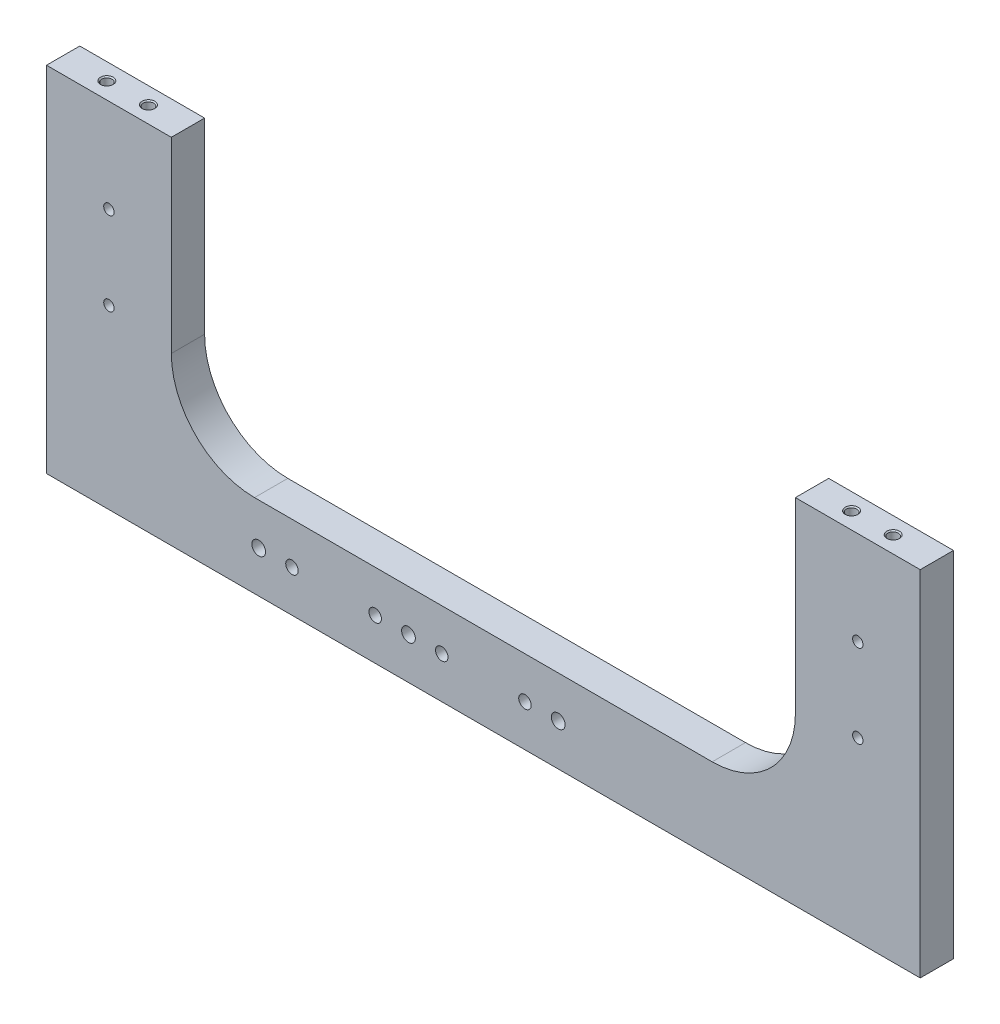
ISO-10303-21;
HEADER;
FILE_DESCRIPTION(('STEP AP214'),'2;1');
FILE_NAME('part.step','',(''),(''),'','','');
FILE_SCHEMA(('AUTOMOTIVE_DESIGN { 1 0 10303 214 1 1 1 1 }'));
ENDSEC;
DATA;
#1=APPLICATION_CONTEXT('core data for automotive mechanical design processes');
#2=APPLICATION_PROTOCOL_DEFINITION('international standard','automotive_design',2000,#1);
#3=PRODUCT_CONTEXT('',#1,'mechanical');
#4=PRODUCT('Part','Part','',(#3));
#5=PRODUCT_RELATED_PRODUCT_CATEGORY('part','',(#4));
#6=PRODUCT_DEFINITION_FORMATION('','',#4);
#7=PRODUCT_DEFINITION_CONTEXT('part definition',#1,'design');
#8=PRODUCT_DEFINITION('design','',#6,#7);
#9=PRODUCT_DEFINITION_SHAPE('','',#8);
#10=(LENGTH_UNIT() NAMED_UNIT(*) SI_UNIT(.MILLI.,.METRE.));
#11=(NAMED_UNIT(*) PLANE_ANGLE_UNIT() SI_UNIT($,.RADIAN.));
#12=(NAMED_UNIT(*) SI_UNIT($,.STERADIAN.) SOLID_ANGLE_UNIT());
#13=UNCERTAINTY_MEASURE_WITH_UNIT(LENGTH_MEASURE(1.E-05),#10,'distance_accuracy_value','');
#14=(GEOMETRIC_REPRESENTATION_CONTEXT(3) GLOBAL_UNCERTAINTY_ASSIGNED_CONTEXT((#13)) GLOBAL_UNIT_ASSIGNED_CONTEXT((#10,
#11,#12)) REPRESENTATION_CONTEXT('',''));
#15=CARTESIAN_POINT('',(0.,0.,0.));
#16=DIRECTION('',(0.,0.,1.));
#17=DIRECTION('',(1.,0.,0.));
#18=AXIS2_PLACEMENT_3D('',#15,#16,#17);
#19=CARTESIAN_POINT('',(-105.,42.5,8.));
#20=DIRECTION('',(0.,-1.,0.));
#21=DIRECTION('',(0.,0.,-1.));
#22=AXIS2_PLACEMENT_3D('',#19,#20,#21);
#23=PLANE('',#22);
#24=CARTESIAN_POINT('',(-84.5,42.5,4.));
#25=DIRECTION('',(0.,1.,0.));
#26=DIRECTION('',(0.,0.,1.));
#27=AXIS2_PLACEMENT_3D('',#24,#25,#26);
#28=CIRCLE('',#27,1.525);
#29=CARTESIAN_POINT('',(-84.5,42.5,5.525));
#30=VERTEX_POINT('',#29);
#31=EDGE_CURVE('E295',#30,#30,#28,.T.);
#32=ORIENTED_EDGE('',*,*,#31,.F.);
#33=EDGE_LOOP('',(#32));
#34=FACE_BOUND('',#33,.T.);
#35=CARTESIAN_POINT('',(-94.5,42.5,4.));
#36=DIRECTION('',(0.,1.,0.));
#37=DIRECTION('',(0.,0.,1.));
#38=AXIS2_PLACEMENT_3D('',#35,#36,#37);
#39=CIRCLE('',#38,1.525);
#40=CARTESIAN_POINT('',(-94.5,42.5,5.525));
#41=VERTEX_POINT('',#40);
#42=EDGE_CURVE('E285',#41,#41,#39,.T.);
#43=ORIENTED_EDGE('',*,*,#42,.F.);
#44=EDGE_LOOP('',(#43));
#45=FACE_BOUND('',#44,.T.);
#46=DIRECTION('',(-1.,0.,0.));
#47=VECTOR('',#46,1.);
#48=CARTESIAN_POINT('',(-105.,42.5,8.));
#49=LINE('',#48,#47);
#50=CARTESIAN_POINT('',(-75.,42.5,8.));
#51=VERTEX_POINT('',#50);
#52=CARTESIAN_POINT('',(-105.,42.5,8.));
#53=VERTEX_POINT('',#52);
#54=EDGE_CURVE('E261',#51,#53,#49,.T.);
#55=ORIENTED_EDGE('',*,*,#54,.F.);
#56=DIRECTION('',(0.,0.,1.));
#57=VECTOR('',#56,1.);
#58=CARTESIAN_POINT('',(-75.,42.5,0.));
#59=LINE('',#58,#57);
#60=CARTESIAN_POINT('',(-75.,42.5,0.));
#61=VERTEX_POINT('',#60);
#62=EDGE_CURVE('E155',#61,#51,#59,.T.);
#63=ORIENTED_EDGE('',*,*,#62,.F.);
#64=DIRECTION('',(-1.,0.,0.));
#65=VECTOR('',#64,1.);
#66=CARTESIAN_POINT('',(-105.,42.5,0.));
#67=LINE('',#66,#65);
#68=CARTESIAN_POINT('',(-105.,42.5,0.));
#69=VERTEX_POINT('',#68);
#70=EDGE_CURVE('E162',#61,#69,#67,.T.);
#71=ORIENTED_EDGE('',*,*,#70,.T.);
#72=DIRECTION('',(0.,0.,-1.));
#73=VECTOR('',#72,1.);
#74=CARTESIAN_POINT('',(-105.,42.5,8.));
#75=LINE('',#74,#73);
#76=EDGE_CURVE('E171',#53,#69,#75,.T.);
#77=ORIENTED_EDGE('',*,*,#76,.F.);
#78=EDGE_LOOP('',(#55,#63,#71,#77));
#79=FACE_BOUND('',#78,.T.);
#80=ADVANCED_FACE('F44',(#34,#45,#79),#23,.F.);
#81=CARTESIAN_POINT('',(-105.,42.5,8.));
#82=DIRECTION('',(1.,0.,0.));
#83=DIRECTION('',(0.,0.,-1.));
#84=AXIS2_PLACEMENT_3D('',#81,#82,#83);
#85=PLANE('',#84);
#86=DIRECTION('',(0.,-1.,0.));
#87=VECTOR('',#86,1.);
#88=CARTESIAN_POINT('',(-105.,42.5,0.));
#89=LINE('',#88,#87);
#90=CARTESIAN_POINT('',(-105.,-42.5,0.));
#91=VERTEX_POINT('',#90);
#92=EDGE_CURVE('E256',#69,#91,#89,.T.);
#93=ORIENTED_EDGE('',*,*,#92,.T.);
#94=DIRECTION('',(0.,0.,-1.));
#95=VECTOR('',#94,1.);
#96=CARTESIAN_POINT('',(-105.,-42.5,8.));
#97=LINE('',#96,#95);
#98=CARTESIAN_POINT('',(-105.,-42.5,8.));
#99=VERTEX_POINT('',#98);
#100=EDGE_CURVE('E179',#99,#91,#97,.T.);
#101=ORIENTED_EDGE('',*,*,#100,.F.);
#102=DIRECTION('',(0.,-1.,0.));
#103=VECTOR('',#102,1.);
#104=CARTESIAN_POINT('',(-105.,42.5,8.));
#105=LINE('',#104,#103);
#106=EDGE_CURVE('E161',#53,#99,#105,.T.);
#107=ORIENTED_EDGE('',*,*,#106,.F.);
#108=ORIENTED_EDGE('',*,*,#76,.T.);
#109=EDGE_LOOP('',(#93,#101,#107,#108));
#110=FACE_BOUND('',#109,.T.);
#111=ADVANCED_FACE('F214',(#110),#85,.F.);
#112=CARTESIAN_POINT('',(-105.,-42.5,8.));
#113=DIRECTION('',(0.,1.,0.));
#114=DIRECTION('',(0.,0.,1.));
#115=AXIS2_PLACEMENT_3D('',#112,#113,#114);
#116=PLANE('',#115);
#117=DIRECTION('',(1.,0.,0.));
#118=VECTOR('',#117,1.);
#119=CARTESIAN_POINT('',(-105.,-42.5,0.));
#120=LINE('',#119,#118);
#121=CARTESIAN_POINT('',(105.,-42.5,0.));
#122=VERTEX_POINT('',#121);
#123=EDGE_CURVE('E264',#91,#122,#120,.T.);
#124=ORIENTED_EDGE('',*,*,#123,.T.);
#125=DIRECTION('',(0.,0.,-1.));
#126=VECTOR('',#125,1.);
#127=CARTESIAN_POINT('',(105.,-42.5,8.));
#128=LINE('',#127,#126);
#129=CARTESIAN_POINT('',(105.,-42.5,8.));
#130=VERTEX_POINT('',#129);
#131=EDGE_CURVE('E176',#130,#122,#128,.T.);
#132=ORIENTED_EDGE('',*,*,#131,.F.);
#133=DIRECTION('',(1.,0.,0.));
#134=VECTOR('',#133,1.);
#135=CARTESIAN_POINT('',(-105.,-42.5,8.));
#136=LINE('',#135,#134);
#137=EDGE_CURVE('E165',#99,#130,#136,.T.);
#138=ORIENTED_EDGE('',*,*,#137,.F.);
#139=ORIENTED_EDGE('',*,*,#100,.T.);
#140=EDGE_LOOP('',(#124,#132,#138,#139));
#141=FACE_BOUND('',#140,.T.);
#142=ADVANCED_FACE('F220',(#141),#116,.F.);
#143=CARTESIAN_POINT('',(105.,42.5,8.));
#144=DIRECTION('',(-1.,0.,0.));
#145=DIRECTION('',(0.,0.,1.));
#146=AXIS2_PLACEMENT_3D('',#143,#144,#145);
#147=PLANE('',#146);
#148=DIRECTION('',(0.,1.,0.));
#149=VECTOR('',#148,1.);
#150=CARTESIAN_POINT('',(105.,42.5,0.));
#151=LINE('',#150,#149);
#152=CARTESIAN_POINT('',(105.,42.5,0.));
#153=VERTEX_POINT('',#152);
#154=EDGE_CURVE('E167',#122,#153,#151,.T.);
#155=ORIENTED_EDGE('',*,*,#154,.T.);
#156=DIRECTION('',(0.,0.,-1.));
#157=VECTOR('',#156,1.);
#158=CARTESIAN_POINT('',(105.,42.5,8.));
#159=LINE('',#158,#157);
#160=CARTESIAN_POINT('',(105.,42.5,8.));
#161=VERTEX_POINT('',#160);
#162=EDGE_CURVE('E160',#161,#153,#159,.T.);
#163=ORIENTED_EDGE('',*,*,#162,.F.);
#164=DIRECTION('',(0.,1.,0.));
#165=VECTOR('',#164,1.);
#166=CARTESIAN_POINT('',(105.,42.5,8.));
#167=LINE('',#166,#165);
#168=EDGE_CURVE('E259',#130,#161,#167,.T.);
#169=ORIENTED_EDGE('',*,*,#168,.F.);
#170=ORIENTED_EDGE('',*,*,#131,.T.);
#171=EDGE_LOOP('',(#155,#163,#169,#170));
#172=FACE_BOUND('',#171,.T.);
#173=ADVANCED_FACE('F227',(#172),#147,.F.);
#174=CARTESIAN_POINT('',(84.5,42.5,4.));
#175=DIRECTION('',(0.,1.,0.));
#176=DIRECTION('',(0.,0.,1.));
#177=AXIS2_PLACEMENT_3D('',#174,#175,#176);
#178=CIRCLE('',#177,1.525);
#179=CARTESIAN_POINT('',(84.5,42.5,5.525));
#180=VERTEX_POINT('',#179);
#181=EDGE_CURVE('E239',#180,#180,#178,.T.);
#182=ORIENTED_EDGE('',*,*,#181,.F.);
#183=EDGE_LOOP('',(#182));
#184=FACE_BOUND('',#183,.T.);
#185=CARTESIAN_POINT('',(94.5,42.5,4.));
#186=DIRECTION('',(0.,1.,0.));
#187=DIRECTION('',(0.,0.,1.));
#188=AXIS2_PLACEMENT_3D('',#185,#186,#187);
#189=CIRCLE('',#188,1.525);
#190=CARTESIAN_POINT('',(94.5,42.5,5.525));
#191=VERTEX_POINT('',#190);
#192=EDGE_CURVE('E242',#191,#191,#189,.T.);
#193=ORIENTED_EDGE('',*,*,#192,.F.);
#194=EDGE_LOOP('',(#193));
#195=FACE_BOUND('',#194,.T.);
#196=CARTESIAN_POINT('',(75.,42.5,0.));
#197=VERTEX_POINT('',#196);
#198=EDGE_CURVE('E138',#153,#197,#67,.T.);
#199=ORIENTED_EDGE('',*,*,#198,.T.);
#200=DIRECTION('',(0.,0.,1.));
#201=VECTOR('',#200,1.);
#202=CARTESIAN_POINT('',(75.,42.5,0.));
#203=LINE('',#202,#201);
#204=CARTESIAN_POINT('',(75.,42.5,8.));
#205=VERTEX_POINT('',#204);
#206=EDGE_CURVE('E145',#197,#205,#203,.T.);
#207=ORIENTED_EDGE('',*,*,#206,.T.);
#208=EDGE_CURVE('E174',#161,#205,#49,.T.);
#209=ORIENTED_EDGE('',*,*,#208,.F.);
#210=ORIENTED_EDGE('',*,*,#162,.T.);
#211=EDGE_LOOP('',(#199,#207,#209,#210));
#212=FACE_BOUND('',#211,.T.);
#213=ADVANCED_FACE('F158',(#184,#195,#212),#23,.F.);
#214=CARTESIAN_POINT('',(0.,0.,8.));
#215=DIRECTION('',(0.,0.,1.));
#216=DIRECTION('',(1.,0.,0.));
#217=AXIS2_PLACEMENT_3D('',#214,#215,#216);
#218=PLANE('',#217);
#219=CARTESIAN_POINT('',(-90.,20.,8.));
#220=DIRECTION('',(0.,0.,1.));
#221=DIRECTION('',(1.,0.,0.));
#222=AXIS2_PLACEMENT_3D('',#219,#220,#221);
#223=CIRCLE('',#222,1.25);
#224=CARTESIAN_POINT('',(-88.75,20.,8.));
#225=VERTEX_POINT('',#224);
#226=EDGE_CURVE('E429',#225,#225,#223,.T.);
#227=ORIENTED_EDGE('',*,*,#226,.F.);
#228=EDGE_LOOP('',(#227));
#229=FACE_BOUND('',#228,.T.);
#230=CARTESIAN_POINT('',(-90.,0.,8.));
#231=DIRECTION('',(0.,0.,1.));
#232=DIRECTION('',(1.,0.,0.));
#233=AXIS2_PLACEMENT_3D('',#230,#231,#232);
#234=CIRCLE('',#233,1.25);
#235=CARTESIAN_POINT('',(-88.75,0.,8.));
#236=VERTEX_POINT('',#235);
#237=EDGE_CURVE('E425',#236,#236,#234,.T.);
#238=ORIENTED_EDGE('',*,*,#237,.F.);
#239=EDGE_LOOP('',(#238));
#240=FACE_BOUND('',#239,.T.);
#241=CARTESIAN_POINT('',(90.,0.,8.));
#242=DIRECTION('',(0.,0.,1.));
#243=DIRECTION('',(1.,0.,0.));
#244=AXIS2_PLACEMENT_3D('',#241,#242,#243);
#245=CIRCLE('',#244,1.25);
#246=CARTESIAN_POINT('',(91.25,0.,8.));
#247=VERTEX_POINT('',#246);
#248=EDGE_CURVE('E421',#247,#247,#245,.T.);
#249=ORIENTED_EDGE('',*,*,#248,.F.);
#250=EDGE_LOOP('',(#249));
#251=FACE_BOUND('',#250,.T.);
#252=CARTESIAN_POINT('',(90.0000000000001,19.9999999999999,8.));
#253=DIRECTION('',(0.,0.,1.));
#254=DIRECTION('',(1.,0.,0.));
#255=AXIS2_PLACEMENT_3D('',#252,#253,#254);
#256=CIRCLE('',#255,1.25);
#257=CARTESIAN_POINT('',(91.2500000000001,19.9999999999999,8.));
#258=VERTEX_POINT('',#257);
#259=EDGE_CURVE('E417',#258,#258,#256,.T.);
#260=ORIENTED_EDGE('',*,*,#259,.F.);
#261=EDGE_LOOP('',(#260));
#262=FACE_BOUND('',#261,.T.);
#263=CARTESIAN_POINT('',(-54.,-32.5,8.));
#264=DIRECTION('',(0.,0.,1.));
#265=DIRECTION('',(1.,0.,0.));
#266=AXIS2_PLACEMENT_3D('',#263,#264,#265);
#267=CIRCLE('',#266,1.65);
#268=CARTESIAN_POINT('',(-52.35,-32.5,8.));
#269=VERTEX_POINT('',#268);
#270=EDGE_CURVE('E413',#269,#269,#267,.T.);
#271=ORIENTED_EDGE('',*,*,#270,.F.);
#272=EDGE_LOOP('',(#271));
#273=FACE_BOUND('',#272,.T.);
#274=CARTESIAN_POINT('',(-26.,-32.5,8.));
#275=DIRECTION('',(0.,0.,1.));
#276=DIRECTION('',(1.,0.,0.));
#277=AXIS2_PLACEMENT_3D('',#274,#275,#276);
#278=CIRCLE('',#277,1.49999999999999);
#279=CARTESIAN_POINT('',(-24.5,-32.5,8.));
#280=VERTEX_POINT('',#279);
#281=EDGE_CURVE('E408',#280,#280,#278,.T.);
#282=ORIENTED_EDGE('',*,*,#281,.F.);
#283=EDGE_LOOP('',(#282));
#284=FACE_BOUND('',#283,.T.);
#285=CARTESIAN_POINT('',(-46.,-32.5,8.));
#286=DIRECTION('',(0.,0.,1.));
#287=DIRECTION('',(1.,0.,0.));
#288=AXIS2_PLACEMENT_3D('',#285,#286,#287);
#289=CIRCLE('',#288,1.49999999999999);
#290=CARTESIAN_POINT('',(-44.5,-32.5,8.));
#291=VERTEX_POINT('',#290);
#292=EDGE_CURVE('E404',#291,#291,#289,.T.);
#293=ORIENTED_EDGE('',*,*,#292,.F.);
#294=EDGE_LOOP('',(#293));
#295=FACE_BOUND('',#294,.T.);
#296=CARTESIAN_POINT('',(-18.,-32.5,8.));
#297=DIRECTION('',(0.,0.,1.));
#298=DIRECTION('',(1.,0.,0.));
#299=AXIS2_PLACEMENT_3D('',#296,#297,#298);
#300=CIRCLE('',#299,1.65);
#301=CARTESIAN_POINT('',(-16.35,-32.5,8.));
#302=VERTEX_POINT('',#301);
#303=EDGE_CURVE('E401',#302,#302,#300,.T.);
#304=ORIENTED_EDGE('',*,*,#303,.F.);
#305=EDGE_LOOP('',(#304));
#306=FACE_BOUND('',#305,.T.);
#307=CARTESIAN_POINT('',(18.,-32.5,8.));
#308=DIRECTION('',(0.,0.,1.));
#309=DIRECTION('',(1.,0.,0.));
#310=AXIS2_PLACEMENT_3D('',#307,#308,#309);
#311=CIRCLE('',#310,1.65);
#312=CARTESIAN_POINT('',(19.65,-32.5,8.));
#313=VERTEX_POINT('',#312);
#314=EDGE_CURVE('E397',#313,#313,#311,.T.);
#315=ORIENTED_EDGE('',*,*,#314,.F.);
#316=EDGE_LOOP('',(#315));
#317=FACE_BOUND('',#316,.T.);
#318=CARTESIAN_POINT('',(-10.,-32.5,8.));
#319=DIRECTION('',(0.,0.,1.));
#320=DIRECTION('',(1.,0.,0.));
#321=AXIS2_PLACEMENT_3D('',#318,#319,#320);
#322=CIRCLE('',#321,1.49999999999999);
#323=CARTESIAN_POINT('',(-8.50000000000001,-32.5,8.));
#324=VERTEX_POINT('',#323);
#325=EDGE_CURVE('E391',#324,#324,#322,.T.);
#326=ORIENTED_EDGE('',*,*,#325,.F.);
#327=EDGE_LOOP('',(#326));
#328=FACE_BOUND('',#327,.T.);
#329=CARTESIAN_POINT('',(10.,-32.5,8.));
#330=DIRECTION('',(0.,0.,1.));
#331=DIRECTION('',(1.,0.,0.));
#332=AXIS2_PLACEMENT_3D('',#329,#330,#331);
#333=CIRCLE('',#332,1.49999999999999);
#334=CARTESIAN_POINT('',(11.5,-32.5,8.));
#335=VERTEX_POINT('',#334);
#336=EDGE_CURVE('E387',#335,#335,#333,.T.);
#337=ORIENTED_EDGE('',*,*,#336,.F.);
#338=EDGE_LOOP('',(#337));
#339=FACE_BOUND('',#338,.T.);
#340=DIRECTION('',(0.,-1.,0.));
#341=VECTOR('',#340,1.);
#342=CARTESIAN_POINT('',(-75.,42.5,8.));
#343=LINE('',#342,#341);
#344=CARTESIAN_POINT('',(-75.,-2.50000000000001,8.));
#345=VERTEX_POINT('',#344);
#346=EDGE_CURVE('E201',#51,#345,#343,.T.);
#347=ORIENTED_EDGE('',*,*,#346,.F.);
#348=ORIENTED_EDGE('',*,*,#54,.T.);
#349=ORIENTED_EDGE('',*,*,#106,.T.);
#350=ORIENTED_EDGE('',*,*,#137,.T.);
#351=ORIENTED_EDGE('',*,*,#168,.T.);
#352=ORIENTED_EDGE('',*,*,#208,.T.);
#353=DIRECTION('',(0.,1.,0.));
#354=VECTOR('',#353,1.);
#355=CARTESIAN_POINT('',(75.,42.5,8.));
#356=LINE('',#355,#354);
#357=CARTESIAN_POINT('',(75.,-2.50000000000001,8.));
#358=VERTEX_POINT('',#357);
#359=EDGE_CURVE('E151',#358,#205,#356,.T.);
#360=ORIENTED_EDGE('',*,*,#359,.F.);
#361=CARTESIAN_POINT('',(55.,-2.5,8.));
#362=DIRECTION('',(0.,0.,1.));
#363=DIRECTION('',(1.,0.,0.));
#364=AXIS2_PLACEMENT_3D('',#361,#362,#363);
#365=CIRCLE('',#364,20.);
#366=CARTESIAN_POINT('',(55.,-22.5,8.));
#367=VERTEX_POINT('',#366);
#368=EDGE_CURVE('E190',#358,#367,#365,.F.);
#369=ORIENTED_EDGE('',*,*,#368,.T.);
#370=DIRECTION('',(1.,0.,0.));
#371=VECTOR('',#370,1.);
#372=CARTESIAN_POINT('',(-75.,-22.5,8.));
#373=LINE('',#372,#371);
#374=CARTESIAN_POINT('',(-55.,-22.5,8.));
#375=VERTEX_POINT('',#374);
#376=EDGE_CURVE('E194',#375,#367,#373,.T.);
#377=ORIENTED_EDGE('',*,*,#376,.F.);
#378=CARTESIAN_POINT('',(-55.,-2.5,8.));
#379=DIRECTION('',(0.,0.,1.));
#380=DIRECTION('',(1.,0.,0.));
#381=AXIS2_PLACEMENT_3D('',#378,#379,#380);
#382=CIRCLE('',#381,20.);
#383=EDGE_CURVE('E52',#375,#345,#382,.F.);
#384=ORIENTED_EDGE('',*,*,#383,.T.);
#385=EDGE_LOOP('',(#347,#348,#349,#350,#351,#352,#360,#369,#377,#384));
#386=FACE_BOUND('',#385,.T.);
#387=ADVANCED_FACE('F193',(#229,#240,#251,#262,#273,#284,#295,#306,#317,#328,#339,#386),#218,.T.);
#388=CARTESIAN_POINT('',(0.,0.,0.));
#389=DIRECTION('',(0.,0.,1.));
#390=DIRECTION('',(1.,0.,0.));
#391=AXIS2_PLACEMENT_3D('',#388,#389,#390);
#392=PLANE('',#391);
#393=CARTESIAN_POINT('',(-90.,20.,0.));
#394=DIRECTION('',(0.,0.,1.));
#395=DIRECTION('',(1.,0.,0.));
#396=AXIS2_PLACEMENT_3D('',#393,#394,#395);
#397=CIRCLE('',#396,1.25);
#398=CARTESIAN_POINT('',(-88.75,20.,0.));
#399=VERTEX_POINT('',#398);
#400=EDGE_CURVE('E347',#399,#399,#397,.T.);
#401=ORIENTED_EDGE('',*,*,#400,.T.);
#402=EDGE_LOOP('',(#401));
#403=FACE_BOUND('',#402,.T.);
#404=CARTESIAN_POINT('',(-90.,0.,0.));
#405=DIRECTION('',(0.,0.,1.));
#406=DIRECTION('',(1.,0.,0.));
#407=AXIS2_PLACEMENT_3D('',#404,#405,#406);
#408=CIRCLE('',#407,1.25);
#409=CARTESIAN_POINT('',(-88.75,0.,0.));
#410=VERTEX_POINT('',#409);
#411=EDGE_CURVE('E351',#410,#410,#408,.T.);
#412=ORIENTED_EDGE('',*,*,#411,.T.);
#413=EDGE_LOOP('',(#412));
#414=FACE_BOUND('',#413,.T.);
#415=CARTESIAN_POINT('',(90.,0.,0.));
#416=DIRECTION('',(0.,0.,1.));
#417=DIRECTION('',(1.,0.,0.));
#418=AXIS2_PLACEMENT_3D('',#415,#416,#417);
#419=CIRCLE('',#418,1.25);
#420=CARTESIAN_POINT('',(91.25,0.,0.));
#421=VERTEX_POINT('',#420);
#422=EDGE_CURVE('E355',#421,#421,#419,.T.);
#423=ORIENTED_EDGE('',*,*,#422,.T.);
#424=EDGE_LOOP('',(#423));
#425=FACE_BOUND('',#424,.T.);
#426=CARTESIAN_POINT('',(90.0000000000001,19.9999999999999,0.));
#427=DIRECTION('',(0.,0.,1.));
#428=DIRECTION('',(1.,0.,0.));
#429=AXIS2_PLACEMENT_3D('',#426,#427,#428);
#430=CIRCLE('',#429,1.25);
#431=CARTESIAN_POINT('',(91.2500000000001,19.9999999999999,0.));
#432=VERTEX_POINT('',#431);
#433=EDGE_CURVE('E359',#432,#432,#430,.T.);
#434=ORIENTED_EDGE('',*,*,#433,.T.);
#435=EDGE_LOOP('',(#434));
#436=FACE_BOUND('',#435,.T.);
#437=CARTESIAN_POINT('',(-54.,-32.5,0.));
#438=DIRECTION('',(0.,0.,1.));
#439=DIRECTION('',(1.,0.,0.));
#440=AXIS2_PLACEMENT_3D('',#437,#438,#439);
#441=CIRCLE('',#440,1.65);
#442=CARTESIAN_POINT('',(-52.35,-32.5,0.));
#443=VERTEX_POINT('',#442);
#444=EDGE_CURVE('E363',#443,#443,#441,.T.);
#445=ORIENTED_EDGE('',*,*,#444,.T.);
#446=EDGE_LOOP('',(#445));
#447=FACE_BOUND('',#446,.T.);
#448=CARTESIAN_POINT('',(-26.,-32.5,0.));
#449=DIRECTION('',(0.,0.,1.));
#450=DIRECTION('',(1.,0.,0.));
#451=AXIS2_PLACEMENT_3D('',#448,#449,#450);
#452=CIRCLE('',#451,1.5);
#453=CARTESIAN_POINT('',(-24.5,-32.5,0.));
#454=VERTEX_POINT('',#453);
#455=EDGE_CURVE('E367',#454,#454,#452,.T.);
#456=ORIENTED_EDGE('',*,*,#455,.T.);
#457=EDGE_LOOP('',(#456));
#458=FACE_BOUND('',#457,.T.);
#459=CARTESIAN_POINT('',(-46.,-32.5,0.));
#460=DIRECTION('',(0.,0.,1.));
#461=DIRECTION('',(1.,0.,0.));
#462=AXIS2_PLACEMENT_3D('',#459,#460,#461);
#463=CIRCLE('',#462,1.5);
#464=CARTESIAN_POINT('',(-44.5,-32.5,0.));
#465=VERTEX_POINT('',#464);
#466=EDGE_CURVE('E371',#465,#465,#463,.T.);
#467=ORIENTED_EDGE('',*,*,#466,.T.);
#468=EDGE_LOOP('',(#467));
#469=FACE_BOUND('',#468,.T.);
#470=CARTESIAN_POINT('',(-18.,-32.5,0.));
#471=DIRECTION('',(0.,0.,1.));
#472=DIRECTION('',(1.,0.,0.));
#473=AXIS2_PLACEMENT_3D('',#470,#471,#472);
#474=CIRCLE('',#473,1.65);
#475=CARTESIAN_POINT('',(-16.35,-32.5,0.));
#476=VERTEX_POINT('',#475);
#477=EDGE_CURVE('E375',#476,#476,#474,.T.);
#478=ORIENTED_EDGE('',*,*,#477,.T.);
#479=EDGE_LOOP('',(#478));
#480=FACE_BOUND('',#479,.T.);
#481=CARTESIAN_POINT('',(18.,-32.5,0.));
#482=DIRECTION('',(0.,0.,1.));
#483=DIRECTION('',(1.,0.,0.));
#484=AXIS2_PLACEMENT_3D('',#481,#482,#483);
#485=CIRCLE('',#484,1.65);
#486=CARTESIAN_POINT('',(19.65,-32.5,0.));
#487=VERTEX_POINT('',#486);
#488=EDGE_CURVE('E379',#487,#487,#485,.T.);
#489=ORIENTED_EDGE('',*,*,#488,.T.);
#490=EDGE_LOOP('',(#489));
#491=FACE_BOUND('',#490,.T.);
#492=CARTESIAN_POINT('',(-10.,-32.5,0.));
#493=DIRECTION('',(0.,0.,1.));
#494=DIRECTION('',(1.,0.,0.));
#495=AXIS2_PLACEMENT_3D('',#492,#493,#494);
#496=CIRCLE('',#495,1.5);
#497=CARTESIAN_POINT('',(-8.5,-32.5,0.));
#498=VERTEX_POINT('',#497);
#499=EDGE_CURVE('E383',#498,#498,#496,.T.);
#500=ORIENTED_EDGE('',*,*,#499,.T.);
#501=EDGE_LOOP('',(#500));
#502=FACE_BOUND('',#501,.T.);
#503=CARTESIAN_POINT('',(10.,-32.5,0.));
#504=DIRECTION('',(0.,0.,1.));
#505=DIRECTION('',(1.,0.,0.));
#506=AXIS2_PLACEMENT_3D('',#503,#504,#505);
#507=CIRCLE('',#506,1.5);
#508=CARTESIAN_POINT('',(11.5,-32.5,0.));
#509=VERTEX_POINT('',#508);
#510=EDGE_CURVE('E281',#509,#509,#507,.T.);
#511=ORIENTED_EDGE('',*,*,#510,.T.);
#512=EDGE_LOOP('',(#511));
#513=FACE_BOUND('',#512,.T.);
#514=ORIENTED_EDGE('',*,*,#70,.F.);
#515=DIRECTION('',(0.,-1.,0.));
#516=VECTOR('',#515,1.);
#517=CARTESIAN_POINT('',(-75.,42.5,0.));
#518=LINE('',#517,#516);
#519=CARTESIAN_POINT('',(-75.,-2.50000000000001,0.));
#520=VERTEX_POINT('',#519);
#521=EDGE_CURVE('E275',#61,#520,#518,.T.);
#522=ORIENTED_EDGE('',*,*,#521,.T.);
#523=CARTESIAN_POINT('',(-55.,-2.5,0.));
#524=DIRECTION('',(0.,0.,1.));
#525=DIRECTION('',(1.,0.,0.));
#526=AXIS2_PLACEMENT_3D('',#523,#524,#525);
#527=CIRCLE('',#526,20.);
#528=CARTESIAN_POINT('',(-55.,-22.5,0.));
#529=VERTEX_POINT('',#528);
#530=EDGE_CURVE('E11',#520,#529,#527,.T.);
#531=ORIENTED_EDGE('',*,*,#530,.T.);
#532=DIRECTION('',(1.,0.,0.));
#533=VECTOR('',#532,1.);
#534=CARTESIAN_POINT('',(-75.,-22.5,0.));
#535=LINE('',#534,#533);
#536=CARTESIAN_POINT('',(55.,-22.5,0.));
#537=VERTEX_POINT('',#536);
#538=EDGE_CURVE('E146',#529,#537,#535,.T.);
#539=ORIENTED_EDGE('',*,*,#538,.T.);
#540=CARTESIAN_POINT('',(55.,-2.5,0.));
#541=DIRECTION('',(0.,0.,1.));
#542=DIRECTION('',(1.,0.,0.));
#543=AXIS2_PLACEMENT_3D('',#540,#541,#542);
#544=CIRCLE('',#543,20.);
#545=CARTESIAN_POINT('',(75.,-2.50000000000001,0.));
#546=VERTEX_POINT('',#545);
#547=EDGE_CURVE('E141',#537,#546,#544,.T.);
#548=ORIENTED_EDGE('',*,*,#547,.T.);
#549=DIRECTION('',(0.,1.,0.));
#550=VECTOR('',#549,1.);
#551=CARTESIAN_POINT('',(75.,42.5,0.));
#552=LINE('',#551,#550);
#553=EDGE_CURVE('E132',#546,#197,#552,.T.);
#554=ORIENTED_EDGE('',*,*,#553,.T.);
#555=ORIENTED_EDGE('',*,*,#198,.F.);
#556=ORIENTED_EDGE('',*,*,#154,.F.);
#557=ORIENTED_EDGE('',*,*,#123,.F.);
#558=ORIENTED_EDGE('',*,*,#92,.F.);
#559=EDGE_LOOP('',(#514,#522,#531,#539,#548,#554,#555,#556,#557,#558));
#560=FACE_BOUND('',#559,.T.);
#561=ADVANCED_FACE('F135',(#403,#414,#425,#436,#447,#458,#469,#480,#491,#502,#513,#560),#392,.F.);
#562=CARTESIAN_POINT('',(94.5,34.,4.));
#563=DIRECTION('',(0.,1.,0.));
#564=DIRECTION('',(0.,0.,1.));
#565=AXIS2_PLACEMENT_3D('',#562,#563,#564);
#566=CONICAL_SURFACE('',#565,1.25,1.02974425867666);
#567=CARTESIAN_POINT('',(94.5,33.2489242262155,4.));
#568=VERTEX_POINT('',#567);
#569=VERTEX_LOOP('',#568);
#570=FACE_BOUND('',#569,.T.);
#571=CARTESIAN_POINT('',(94.5,34.,4.));
#572=DIRECTION('',(0.,1.,0.));
#573=DIRECTION('',(0.,0.,1.));
#574=AXIS2_PLACEMENT_3D('',#571,#572,#573);
#575=CIRCLE('',#574,1.25);
#576=CARTESIAN_POINT('',(94.5,34.,5.25));
#577=VERTEX_POINT('',#576);
#578=EDGE_CURVE('E248',#577,#577,#575,.T.);
#579=ORIENTED_EDGE('',*,*,#578,.T.);
#580=EDGE_LOOP('',(#579));
#581=FACE_BOUND('',#580,.T.);
#582=ADVANCED_FACE('F336',(#570,#581),#566,.F.);
#583=CARTESIAN_POINT('',(94.5,42.5,4.));
#584=DIRECTION('',(0.,1.,0.));
#585=DIRECTION('',(0.,0.,1.));
#586=AXIS2_PLACEMENT_3D('',#583,#584,#585);
#587=CYLINDRICAL_SURFACE('',#586,1.25);
#588=ORIENTED_EDGE('',*,*,#578,.F.);
#589=EDGE_LOOP('',(#588));
#590=FACE_BOUND('',#589,.T.);
#591=CARTESIAN_POINT('',(94.5,42.225,4.));
#592=DIRECTION('',(0.,1.,0.));
#593=DIRECTION('',(0.,0.,1.));
#594=AXIS2_PLACEMENT_3D('',#591,#592,#593);
#595=CIRCLE('',#594,1.25);
#596=CARTESIAN_POINT('',(94.5,42.225,5.25));
#597=VERTEX_POINT('',#596);
#598=EDGE_CURVE('E244',#597,#597,#595,.T.);
#599=ORIENTED_EDGE('',*,*,#598,.T.);
#600=EDGE_LOOP('',(#599));
#601=FACE_BOUND('',#600,.T.);
#602=ADVANCED_FACE('F332',(#590,#601),#587,.F.);
#603=CARTESIAN_POINT('',(94.5,42.5,4.));
#604=DIRECTION('',(0.,1.,0.));
#605=DIRECTION('',(0.,0.,1.));
#606=AXIS2_PLACEMENT_3D('',#603,#604,#605);
#607=CONICAL_SURFACE('',#606,1.525,0.785398163397436);
#608=ORIENTED_EDGE('',*,*,#598,.F.);
#609=EDGE_LOOP('',(#608));
#610=FACE_BOUND('',#609,.T.);
#611=ORIENTED_EDGE('',*,*,#192,.T.);
#612=EDGE_LOOP('',(#611));
#613=FACE_BOUND('',#612,.T.);
#614=ADVANCED_FACE('F328',(#610,#613),#607,.F.);
#615=CARTESIAN_POINT('',(84.5,34.,4.));
#616=DIRECTION('',(0.,1.,0.));
#617=DIRECTION('',(0.,0.,1.));
#618=AXIS2_PLACEMENT_3D('',#615,#616,#617);
#619=CONICAL_SURFACE('',#618,1.25,1.02974425867666);
#620=CARTESIAN_POINT('',(84.5,33.2489242262155,4.));
#621=VERTEX_POINT('',#620);
#622=VERTEX_LOOP('',#621);
#623=FACE_BOUND('',#622,.T.);
#624=CARTESIAN_POINT('',(84.5,34.,4.));
#625=DIRECTION('',(0.,1.,0.));
#626=DIRECTION('',(0.,0.,1.));
#627=AXIS2_PLACEMENT_3D('',#624,#625,#626);
#628=CIRCLE('',#627,1.25);
#629=CARTESIAN_POINT('',(84.5,34.,5.25));
#630=VERTEX_POINT('',#629);
#631=EDGE_CURVE('E245',#630,#630,#628,.T.);
#632=ORIENTED_EDGE('',*,*,#631,.T.);
#633=EDGE_LOOP('',(#632));
#634=FACE_BOUND('',#633,.T.);
#635=ADVANCED_FACE('F321',(#623,#634),#619,.F.);
#636=CARTESIAN_POINT('',(84.5,42.5,4.));
#637=DIRECTION('',(0.,1.,0.));
#638=DIRECTION('',(0.,0.,1.));
#639=AXIS2_PLACEMENT_3D('',#636,#637,#638);
#640=CYLINDRICAL_SURFACE('',#639,1.25);
#641=ORIENTED_EDGE('',*,*,#631,.F.);
#642=EDGE_LOOP('',(#641));
#643=FACE_BOUND('',#642,.T.);
#644=CARTESIAN_POINT('',(84.5,42.225,4.));
#645=DIRECTION('',(0.,1.,0.));
#646=DIRECTION('',(0.,0.,1.));
#647=AXIS2_PLACEMENT_3D('',#644,#645,#646);
#648=CIRCLE('',#647,1.25);
#649=CARTESIAN_POINT('',(84.5,42.225,5.25));
#650=VERTEX_POINT('',#649);
#651=EDGE_CURVE('E251',#650,#650,#648,.T.);
#652=ORIENTED_EDGE('',*,*,#651,.T.);
#653=EDGE_LOOP('',(#652));
#654=FACE_BOUND('',#653,.T.);
#655=ADVANCED_FACE('F307',(#643,#654),#640,.F.);
#656=CARTESIAN_POINT('',(84.5,42.5,4.));
#657=DIRECTION('',(0.,1.,0.));
#658=DIRECTION('',(0.,0.,1.));
#659=AXIS2_PLACEMENT_3D('',#656,#657,#658);
#660=CONICAL_SURFACE('',#659,1.525,0.785398163397436);
#661=ORIENTED_EDGE('',*,*,#651,.F.);
#662=EDGE_LOOP('',(#661));
#663=FACE_BOUND('',#662,.T.);
#664=ORIENTED_EDGE('',*,*,#181,.T.);
#665=EDGE_LOOP('',(#664));
#666=FACE_BOUND('',#665,.T.);
#667=ADVANCED_FACE('F309',(#663,#666),#660,.F.);
#668=CARTESIAN_POINT('',(-84.5,34.,4.));
#669=DIRECTION('',(0.,1.,0.));
#670=DIRECTION('',(0.,0.,1.));
#671=AXIS2_PLACEMENT_3D('',#668,#669,#670);
#672=CONICAL_SURFACE('',#671,1.25,1.02974425867666);
#673=CARTESIAN_POINT('',(-84.5,33.2489242262155,4.));
#674=VERTEX_POINT('',#673);
#675=VERTEX_LOOP('',#674);
#676=FACE_BOUND('',#675,.T.);
#677=CARTESIAN_POINT('',(-84.5,34.,4.));
#678=DIRECTION('',(0.,1.,0.));
#679=DIRECTION('',(0.,0.,1.));
#680=AXIS2_PLACEMENT_3D('',#677,#678,#679);
#681=CIRCLE('',#680,1.25);
#682=CARTESIAN_POINT('',(-84.5,34.,5.25));
#683=VERTEX_POINT('',#682);
#684=EDGE_CURVE('E301',#683,#683,#681,.T.);
#685=ORIENTED_EDGE('',*,*,#684,.T.);
#686=EDGE_LOOP('',(#685));
#687=FACE_BOUND('',#686,.T.);
#688=ADVANCED_FACE('F312',(#676,#687),#672,.F.);
#689=CARTESIAN_POINT('',(-84.5,42.5,4.));
#690=DIRECTION('',(0.,1.,0.));
#691=DIRECTION('',(0.,0.,1.));
#692=AXIS2_PLACEMENT_3D('',#689,#690,#691);
#693=CYLINDRICAL_SURFACE('',#692,1.25);
#694=ORIENTED_EDGE('',*,*,#684,.F.);
#695=EDGE_LOOP('',(#694));
#696=FACE_BOUND('',#695,.T.);
#697=CARTESIAN_POINT('',(-84.5,42.225,4.));
#698=DIRECTION('',(0.,1.,0.));
#699=DIRECTION('',(0.,0.,1.));
#700=AXIS2_PLACEMENT_3D('',#697,#698,#699);
#701=CIRCLE('',#700,1.25);
#702=CARTESIAN_POINT('',(-84.5,42.225,5.25));
#703=VERTEX_POINT('',#702);
#704=EDGE_CURVE('E298',#703,#703,#701,.T.);
#705=ORIENTED_EDGE('',*,*,#704,.T.);
#706=EDGE_LOOP('',(#705));
#707=FACE_BOUND('',#706,.T.);
#708=ADVANCED_FACE('F318',(#696,#707),#693,.F.);
#709=CARTESIAN_POINT('',(-84.5,42.5,4.));
#710=DIRECTION('',(0.,1.,0.));
#711=DIRECTION('',(0.,0.,1.));
#712=AXIS2_PLACEMENT_3D('',#709,#710,#711);
#713=CONICAL_SURFACE('',#712,1.525,0.785398163397436);
#714=ORIENTED_EDGE('',*,*,#704,.F.);
#715=EDGE_LOOP('',(#714));
#716=FACE_BOUND('',#715,.T.);
#717=ORIENTED_EDGE('',*,*,#31,.T.);
#718=EDGE_LOOP('',(#717));
#719=FACE_BOUND('',#718,.T.);
#720=ADVANCED_FACE('F486',(#716,#719),#713,.F.);
#721=CARTESIAN_POINT('',(-94.5,34.,4.));
#722=DIRECTION('',(0.,1.,0.));
#723=DIRECTION('',(0.,0.,1.));
#724=AXIS2_PLACEMENT_3D('',#721,#722,#723);
#725=CONICAL_SURFACE('',#724,1.25,1.02974425867666);
#726=CARTESIAN_POINT('',(-94.5,33.2489242262155,4.));
#727=VERTEX_POINT('',#726);
#728=VERTEX_LOOP('',#727);
#729=FACE_BOUND('',#728,.T.);
#730=CARTESIAN_POINT('',(-94.5,34.,4.));
#731=DIRECTION('',(0.,1.,0.));
#732=DIRECTION('',(0.,0.,1.));
#733=AXIS2_PLACEMENT_3D('',#730,#731,#732);
#734=CIRCLE('',#733,1.25);
#735=CARTESIAN_POINT('',(-94.5,34.,5.25));
#736=VERTEX_POINT('',#735);
#737=EDGE_CURVE('E292',#736,#736,#734,.T.);
#738=ORIENTED_EDGE('',*,*,#737,.T.);
#739=EDGE_LOOP('',(#738));
#740=FACE_BOUND('',#739,.T.);
#741=ADVANCED_FACE('F482',(#729,#740),#725,.F.);
#742=CARTESIAN_POINT('',(-94.5,42.5,4.));
#743=DIRECTION('',(0.,1.,0.));
#744=DIRECTION('',(0.,0.,1.));
#745=AXIS2_PLACEMENT_3D('',#742,#743,#744);
#746=CYLINDRICAL_SURFACE('',#745,1.25);
#747=ORIENTED_EDGE('',*,*,#737,.F.);
#748=EDGE_LOOP('',(#747));
#749=FACE_BOUND('',#748,.T.);
#750=CARTESIAN_POINT('',(-94.5,42.225,4.));
#751=DIRECTION('',(0.,1.,0.));
#752=DIRECTION('',(0.,0.,1.));
#753=AXIS2_PLACEMENT_3D('',#750,#751,#752);
#754=CIRCLE('',#753,1.25);
#755=CARTESIAN_POINT('',(-94.5,42.225,5.25));
#756=VERTEX_POINT('',#755);
#757=EDGE_CURVE('E289',#756,#756,#754,.T.);
#758=ORIENTED_EDGE('',*,*,#757,.T.);
#759=EDGE_LOOP('',(#758));
#760=FACE_BOUND('',#759,.T.);
#761=ADVANCED_FACE('F478',(#749,#760),#746,.F.);
#762=CARTESIAN_POINT('',(-94.5,42.5,4.));
#763=DIRECTION('',(0.,1.,0.));
#764=DIRECTION('',(0.,0.,1.));
#765=AXIS2_PLACEMENT_3D('',#762,#763,#764);
#766=CONICAL_SURFACE('',#765,1.525,0.785398163397436);
#767=ORIENTED_EDGE('',*,*,#757,.F.);
#768=EDGE_LOOP('',(#767));
#769=FACE_BOUND('',#768,.T.);
#770=ORIENTED_EDGE('',*,*,#42,.T.);
#771=EDGE_LOOP('',(#770));
#772=FACE_BOUND('',#771,.T.);
#773=ADVANCED_FACE('F475',(#769,#772),#766,.F.);
#774=CARTESIAN_POINT('',(-75.,42.5,0.));
#775=DIRECTION('',(-1.,0.,0.));
#776=DIRECTION('',(0.,-1.,0.));
#777=AXIS2_PLACEMENT_3D('',#774,#775,#776);
#778=PLANE('',#777);
#779=ORIENTED_EDGE('',*,*,#346,.T.);
#780=DIRECTION('',(0.,0.,1.));
#781=VECTOR('',#780,1.);
#782=CARTESIAN_POINT('',(-75.,-2.50000000000001,0.));
#783=LINE('',#782,#781);
#784=EDGE_CURVE('E59',#345,#520,#783,.F.);
#785=ORIENTED_EDGE('',*,*,#784,.T.);
#786=ORIENTED_EDGE('',*,*,#521,.F.);
#787=ORIENTED_EDGE('',*,*,#62,.T.);
#788=EDGE_LOOP('',(#779,#785,#786,#787));
#789=FACE_BOUND('',#788,.T.);
#790=ADVANCED_FACE('F471',(#789),#778,.F.);
#791=CARTESIAN_POINT('',(75.,42.5,0.));
#792=DIRECTION('',(1.,0.,0.));
#793=DIRECTION('',(0.,1.,0.));
#794=AXIS2_PLACEMENT_3D('',#791,#792,#793);
#795=PLANE('',#794);
#796=ORIENTED_EDGE('',*,*,#553,.F.);
#797=DIRECTION('',(0.,0.,1.));
#798=VECTOR('',#797,1.);
#799=CARTESIAN_POINT('',(75.,-2.50000000000001,8.));
#800=LINE('',#799,#798);
#801=EDGE_CURVE('E182',#546,#358,#800,.T.);
#802=ORIENTED_EDGE('',*,*,#801,.T.);
#803=ORIENTED_EDGE('',*,*,#359,.T.);
#804=ORIENTED_EDGE('',*,*,#206,.F.);
#805=EDGE_LOOP('',(#796,#802,#803,#804));
#806=FACE_BOUND('',#805,.T.);
#807=ADVANCED_FACE('F149',(#806),#795,.F.);
#808=CARTESIAN_POINT('',(-75.,-22.5,0.));
#809=DIRECTION('',(0.,-1.,0.));
#810=DIRECTION('',(0.,0.,-1.));
#811=AXIS2_PLACEMENT_3D('',#808,#809,#810);
#812=PLANE('',#811);
#813=ORIENTED_EDGE('',*,*,#376,.T.);
#814=DIRECTION('',(0.,0.,1.));
#815=VECTOR('',#814,1.);
#816=CARTESIAN_POINT('',(55.,-22.5,0.));
#817=LINE('',#816,#815);
#818=EDGE_CURVE('E187',#367,#537,#817,.F.);
#819=ORIENTED_EDGE('',*,*,#818,.T.);
#820=ORIENTED_EDGE('',*,*,#538,.F.);
#821=DIRECTION('',(0.,0.,1.));
#822=VECTOR('',#821,1.);
#823=CARTESIAN_POINT('',(-55.,-22.5,8.));
#824=LINE('',#823,#822);
#825=EDGE_CURVE('E184',#529,#375,#824,.T.);
#826=ORIENTED_EDGE('',*,*,#825,.T.);
#827=EDGE_LOOP('',(#813,#819,#820,#826));
#828=FACE_BOUND('',#827,.T.);
#829=ADVANCED_FACE('F198',(#828),#812,.F.);
#830=CARTESIAN_POINT('',(55.,-2.5,0.));
#831=DIRECTION('',(0.,0.,-1.));
#832=DIRECTION('',(-1.,0.,0.));
#833=AXIS2_PLACEMENT_3D('',#830,#831,#832);
#834=CYLINDRICAL_SURFACE('',#833,20.);
#835=ORIENTED_EDGE('',*,*,#547,.F.);
#836=ORIENTED_EDGE('',*,*,#818,.F.);
#837=ORIENTED_EDGE('',*,*,#368,.F.);
#838=ORIENTED_EDGE('',*,*,#801,.F.);
#839=EDGE_LOOP('',(#835,#836,#837,#838));
#840=FACE_BOUND('',#839,.T.);
#841=ADVANCED_FACE('F203',(#840),#834,.F.);
#842=CARTESIAN_POINT('',(-55.,-2.5,0.));
#843=DIRECTION('',(0.,0.,-1.));
#844=DIRECTION('',(-1.,0.,0.));
#845=AXIS2_PLACEMENT_3D('',#842,#843,#844);
#846=CYLINDRICAL_SURFACE('',#845,20.);
#847=ORIENTED_EDGE('',*,*,#530,.F.);
#848=ORIENTED_EDGE('',*,*,#784,.F.);
#849=ORIENTED_EDGE('',*,*,#383,.F.);
#850=ORIENTED_EDGE('',*,*,#825,.F.);
#851=EDGE_LOOP('',(#847,#848,#849,#850));
#852=FACE_BOUND('',#851,.T.);
#853=ADVANCED_FACE('F46',(#852),#846,.F.);
#854=CARTESIAN_POINT('',(10.,-32.5,8.));
#855=DIRECTION('',(0.,0.,1.));
#856=DIRECTION('',(1.,0.,0.));
#857=AXIS2_PLACEMENT_3D('',#854,#855,#856);
#858=CYLINDRICAL_SURFACE('',#857,1.49999999999999);
#859=ORIENTED_EDGE('',*,*,#510,.F.);
#860=EDGE_LOOP('',(#859));
#861=FACE_BOUND('',#860,.T.);
#862=ORIENTED_EDGE('',*,*,#336,.T.);
#863=EDGE_LOOP('',(#862));
#864=FACE_BOUND('',#863,.T.);
#865=ADVANCED_FACE('F209',(#861,#864),#858,.F.);
#866=CARTESIAN_POINT('',(-10.,-32.5,8.));
#867=DIRECTION('',(0.,0.,1.));
#868=DIRECTION('',(1.,0.,0.));
#869=AXIS2_PLACEMENT_3D('',#866,#867,#868);
#870=CYLINDRICAL_SURFACE('',#869,1.49999999999999);
#871=ORIENTED_EDGE('',*,*,#499,.F.);
#872=EDGE_LOOP('',(#871));
#873=FACE_BOUND('',#872,.T.);
#874=ORIENTED_EDGE('',*,*,#325,.T.);
#875=EDGE_LOOP('',(#874));
#876=FACE_BOUND('',#875,.T.);
#877=ADVANCED_FACE('F455',(#873,#876),#870,.F.);
#878=CARTESIAN_POINT('',(18.,-32.5,8.));
#879=DIRECTION('',(0.,0.,1.));
#880=DIRECTION('',(1.,0.,0.));
#881=AXIS2_PLACEMENT_3D('',#878,#879,#880);
#882=CYLINDRICAL_SURFACE('',#881,1.65);
#883=ORIENTED_EDGE('',*,*,#488,.F.);
#884=EDGE_LOOP('',(#883));
#885=FACE_BOUND('',#884,.T.);
#886=ORIENTED_EDGE('',*,*,#314,.T.);
#887=EDGE_LOOP('',(#886));
#888=FACE_BOUND('',#887,.T.);
#889=ADVANCED_FACE('F457',(#885,#888),#882,.F.);
#890=CARTESIAN_POINT('',(-18.,-32.5,8.));
#891=DIRECTION('',(0.,0.,1.));
#892=DIRECTION('',(1.,0.,0.));
#893=AXIS2_PLACEMENT_3D('',#890,#891,#892);
#894=CYLINDRICAL_SURFACE('',#893,1.65);
#895=ORIENTED_EDGE('',*,*,#477,.F.);
#896=EDGE_LOOP('',(#895));
#897=FACE_BOUND('',#896,.T.);
#898=ORIENTED_EDGE('',*,*,#303,.T.);
#899=EDGE_LOOP('',(#898));
#900=FACE_BOUND('',#899,.T.);
#901=ADVANCED_FACE('F464',(#897,#900),#894,.F.);
#902=CARTESIAN_POINT('',(-46.,-32.5,8.));
#903=DIRECTION('',(0.,0.,1.));
#904=DIRECTION('',(1.,0.,0.));
#905=AXIS2_PLACEMENT_3D('',#902,#903,#904);
#906=CYLINDRICAL_SURFACE('',#905,1.49999999999999);
#907=ORIENTED_EDGE('',*,*,#466,.F.);
#908=EDGE_LOOP('',(#907));
#909=FACE_BOUND('',#908,.T.);
#910=ORIENTED_EDGE('',*,*,#292,.T.);
#911=EDGE_LOOP('',(#910));
#912=FACE_BOUND('',#911,.T.);
#913=ADVANCED_FACE('F570',(#909,#912),#906,.F.);
#914=CARTESIAN_POINT('',(-26.,-32.5,8.));
#915=DIRECTION('',(0.,0.,1.));
#916=DIRECTION('',(1.,0.,0.));
#917=AXIS2_PLACEMENT_3D('',#914,#915,#916);
#918=CYLINDRICAL_SURFACE('',#917,1.49999999999999);
#919=ORIENTED_EDGE('',*,*,#455,.F.);
#920=EDGE_LOOP('',(#919));
#921=FACE_BOUND('',#920,.T.);
#922=ORIENTED_EDGE('',*,*,#281,.T.);
#923=EDGE_LOOP('',(#922));
#924=FACE_BOUND('',#923,.T.);
#925=ADVANCED_FACE('F580',(#921,#924),#918,.F.);
#926=CARTESIAN_POINT('',(-54.,-32.5,8.));
#927=DIRECTION('',(0.,0.,1.));
#928=DIRECTION('',(1.,0.,0.));
#929=AXIS2_PLACEMENT_3D('',#926,#927,#928);
#930=CYLINDRICAL_SURFACE('',#929,1.65);
#931=ORIENTED_EDGE('',*,*,#444,.F.);
#932=EDGE_LOOP('',(#931));
#933=FACE_BOUND('',#932,.T.);
#934=ORIENTED_EDGE('',*,*,#270,.T.);
#935=EDGE_LOOP('',(#934));
#936=FACE_BOUND('',#935,.T.);
#937=ADVANCED_FACE('F590',(#933,#936),#930,.F.);
#938=CARTESIAN_POINT('',(90.0000000000001,19.9999999999999,8.));
#939=DIRECTION('',(0.,0.,1.));
#940=DIRECTION('',(1.,0.,0.));
#941=AXIS2_PLACEMENT_3D('',#938,#939,#940);
#942=CYLINDRICAL_SURFACE('',#941,1.25);
#943=ORIENTED_EDGE('',*,*,#259,.T.);
#944=EDGE_LOOP('',(#943));
#945=FACE_BOUND('',#944,.T.);
#946=ORIENTED_EDGE('',*,*,#433,.F.);
#947=EDGE_LOOP('',(#946));
#948=FACE_BOUND('',#947,.T.);
#949=ADVANCED_FACE('F600',(#945,#948),#942,.F.);
#950=CARTESIAN_POINT('',(90.,0.,8.));
#951=DIRECTION('',(0.,0.,1.));
#952=DIRECTION('',(1.,0.,0.));
#953=AXIS2_PLACEMENT_3D('',#950,#951,#952);
#954=CYLINDRICAL_SURFACE('',#953,1.25);
#955=ORIENTED_EDGE('',*,*,#248,.T.);
#956=EDGE_LOOP('',(#955));
#957=FACE_BOUND('',#956,.T.);
#958=ORIENTED_EDGE('',*,*,#422,.F.);
#959=EDGE_LOOP('',(#958));
#960=FACE_BOUND('',#959,.T.);
#961=ADVANCED_FACE('F623',(#957,#960),#954,.F.);
#962=CARTESIAN_POINT('',(-90.,0.,8.));
#963=DIRECTION('',(0.,0.,1.));
#964=DIRECTION('',(1.,0.,0.));
#965=AXIS2_PLACEMENT_3D('',#962,#963,#964);
#966=CYLINDRICAL_SURFACE('',#965,1.25);
#967=ORIENTED_EDGE('',*,*,#237,.T.);
#968=EDGE_LOOP('',(#967));
#969=FACE_BOUND('',#968,.T.);
#970=ORIENTED_EDGE('',*,*,#411,.F.);
#971=EDGE_LOOP('',(#970));
#972=FACE_BOUND('',#971,.T.);
#973=ADVANCED_FACE('F634',(#969,#972),#966,.F.);
#974=CARTESIAN_POINT('',(-90.,20.,8.));
#975=DIRECTION('',(0.,0.,1.));
#976=DIRECTION('',(1.,0.,0.));
#977=AXIS2_PLACEMENT_3D('',#974,#975,#976);
#978=CYLINDRICAL_SURFACE('',#977,1.25);
#979=ORIENTED_EDGE('',*,*,#226,.T.);
#980=EDGE_LOOP('',(#979));
#981=FACE_BOUND('',#980,.T.);
#982=ORIENTED_EDGE('',*,*,#400,.F.);
#983=EDGE_LOOP('',(#982));
#984=FACE_BOUND('',#983,.T.);
#985=ADVANCED_FACE('F433',(#981,#984),#978,.F.);
#986=CLOSED_SHELL('',(#80,#111,#142,#173,#213,#387,#561,#582,#602,#614,#635,#655,#667,#688,#708,
#720,#741,#761,#773,#790,#807,#829,#841,#853,#865,#877,#889,#901,#913,#925,#937,#949,#961,#973,#985));
#987=MANIFOLD_SOLID_BREP('B2',#986);
#988=ADVANCED_BREP_SHAPE_REPRESENTATION('',(#18,#987),#14);
#989=SHAPE_DEFINITION_REPRESENTATION(#9,#988);
ENDSEC;
END-ISO-10303-21;
